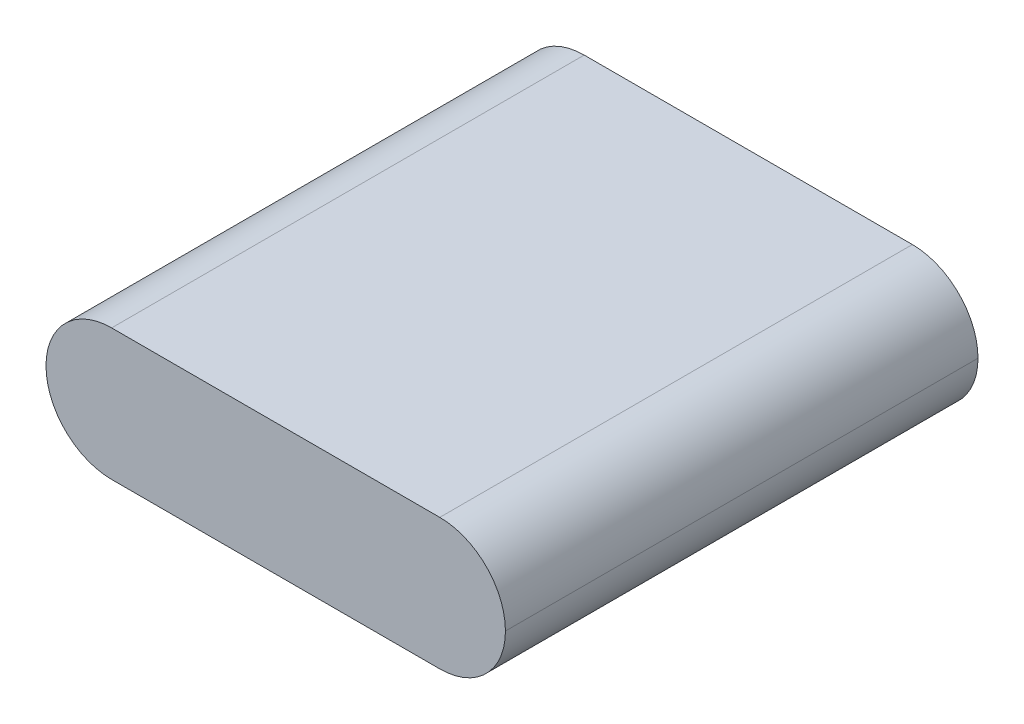
ISO-10303-21;
HEADER;
FILE_DESCRIPTION(('STEP AP214'),'2;1');
FILE_NAME('part.step','',(''),(''),'','','');
FILE_SCHEMA(('AUTOMOTIVE_DESIGN { 1 0 10303 214 1 1 1 1 }'));
ENDSEC;
DATA;
#1=APPLICATION_CONTEXT('core data for automotive mechanical design processes');
#2=APPLICATION_PROTOCOL_DEFINITION('international standard','automotive_design',2000,#1);
#3=PRODUCT_CONTEXT('',#1,'mechanical');
#4=PRODUCT('Part','Part','',(#3));
#5=PRODUCT_RELATED_PRODUCT_CATEGORY('part','',(#4));
#6=PRODUCT_DEFINITION_FORMATION('','',#4);
#7=PRODUCT_DEFINITION_CONTEXT('part definition',#1,'design');
#8=PRODUCT_DEFINITION('design','',#6,#7);
#9=PRODUCT_DEFINITION_SHAPE('','',#8);
#10=(LENGTH_UNIT() NAMED_UNIT(*) SI_UNIT(.MILLI.,.METRE.));
#11=(NAMED_UNIT(*) PLANE_ANGLE_UNIT() SI_UNIT($,.RADIAN.));
#12=(NAMED_UNIT(*) SI_UNIT($,.STERADIAN.) SOLID_ANGLE_UNIT());
#13=UNCERTAINTY_MEASURE_WITH_UNIT(LENGTH_MEASURE(1.E-05),#10,'distance_accuracy_value','');
#14=(GEOMETRIC_REPRESENTATION_CONTEXT(3) GLOBAL_UNCERTAINTY_ASSIGNED_CONTEXT((#13)) GLOBAL_UNIT_ASSIGNED_CONTEXT((#10,
#11,#12)) REPRESENTATION_CONTEXT('',''));
#15=CARTESIAN_POINT('',(0.,0.,0.));
#16=DIRECTION('',(0.,0.,1.));
#17=DIRECTION('',(1.,0.,0.));
#18=AXIS2_PLACEMENT_3D('',#15,#16,#17);
#19=CARTESIAN_POINT('',(0.,20.,0.));
#20=DIRECTION('',(0.,0.,-1.));
#21=DIRECTION('',(-1.,0.,0.));
#22=AXIS2_PLACEMENT_3D('',#19,#20,#21);
#23=PLANE('',#22);
#24=DIRECTION('',(1.,0.,0.));
#25=VECTOR('',#24,1.);
#26=CARTESIAN_POINT('',(0.,0.,0.));
#27=LINE('',#26,#25);
#28=CARTESIAN_POINT('',(10.,0.,0.));
#29=VERTEX_POINT('',#28);
#30=CARTESIAN_POINT('',(60.,0.,0.));
#31=VERTEX_POINT('',#30);
#32=EDGE_CURVE('E88',#29,#31,#27,.T.);
#33=ORIENTED_EDGE('',*,*,#32,.T.);
#34=CARTESIAN_POINT('',(60.,10.,0.));
#35=DIRECTION('',(0.,0.,-1.));
#36=DIRECTION('',(-1.,0.,0.));
#37=AXIS2_PLACEMENT_3D('',#34,#35,#36);
#38=CIRCLE('',#37,10.);
#39=CARTESIAN_POINT('',(70.,10.,0.));
#40=VERTEX_POINT('',#39);
#41=EDGE_CURVE('E114',#31,#40,#38,.F.);
#42=ORIENTED_EDGE('',*,*,#41,.T.);
#43=CARTESIAN_POINT('',(60.,10.,0.));
#44=DIRECTION('',(0.,0.,-1.));
#45=DIRECTION('',(-1.,0.,0.));
#46=AXIS2_PLACEMENT_3D('',#43,#44,#45);
#47=CIRCLE('',#46,10.);
#48=CARTESIAN_POINT('',(60.,20.,0.));
#49=VERTEX_POINT('',#48);
#50=EDGE_CURVE('E96',#40,#49,#47,.F.);
#51=ORIENTED_EDGE('',*,*,#50,.T.);
#52=DIRECTION('',(1.,0.,0.));
#53=VECTOR('',#52,1.);
#54=CARTESIAN_POINT('',(0.,20.,0.));
#55=LINE('',#54,#53);
#56=CARTESIAN_POINT('',(10.,20.,0.));
#57=VERTEX_POINT('',#56);
#58=EDGE_CURVE('E134',#57,#49,#55,.T.);
#59=ORIENTED_EDGE('',*,*,#58,.F.);
#60=CARTESIAN_POINT('',(10.,10.,0.));
#61=DIRECTION('',(0.,0.,-1.));
#62=DIRECTION('',(-1.,0.,0.));
#63=AXIS2_PLACEMENT_3D('',#60,#61,#62);
#64=CIRCLE('',#63,10.);
#65=CARTESIAN_POINT('',(0.,10.,0.));
#66=VERTEX_POINT('',#65);
#67=EDGE_CURVE('E91',#57,#66,#64,.F.);
#68=ORIENTED_EDGE('',*,*,#67,.T.);
#69=CARTESIAN_POINT('',(10.,10.,0.));
#70=DIRECTION('',(0.,0.,-1.));
#71=DIRECTION('',(-1.,0.,0.));
#72=AXIS2_PLACEMENT_3D('',#69,#70,#71);
#73=CIRCLE('',#72,10.);
#74=EDGE_CURVE('E86',#66,#29,#73,.F.);
#75=ORIENTED_EDGE('',*,*,#74,.T.);
#76=EDGE_LOOP('',(#33,#42,#51,#59,#68,#75));
#77=FACE_BOUND('',#76,.T.);
#78=ADVANCED_FACE('F32',(#77),#23,.F.);
#79=CARTESIAN_POINT('',(0.,20.,-72.));
#80=DIRECTION('',(0.,0.,1.));
#81=DIRECTION('',(1.,0.,0.));
#82=AXIS2_PLACEMENT_3D('',#79,#80,#81);
#83=PLANE('',#82);
#84=CARTESIAN_POINT('',(60.,10.,-72.));
#85=DIRECTION('',(0.,0.,1.));
#86=DIRECTION('',(1.,0.,0.));
#87=AXIS2_PLACEMENT_3D('',#84,#85,#86);
#88=CIRCLE('',#87,10.);
#89=CARTESIAN_POINT('',(60.,20.,-72.));
#90=VERTEX_POINT('',#89);
#91=CARTESIAN_POINT('',(70.,10.,-72.));
#92=VERTEX_POINT('',#91);
#93=EDGE_CURVE('E49',#90,#92,#88,.F.);
#94=ORIENTED_EDGE('',*,*,#93,.T.);
#95=CARTESIAN_POINT('',(60.,10.,-72.));
#96=DIRECTION('',(0.,0.,1.));
#97=DIRECTION('',(1.,0.,0.));
#98=AXIS2_PLACEMENT_3D('',#95,#96,#97);
#99=CIRCLE('',#98,10.);
#100=CARTESIAN_POINT('',(60.,0.,-72.));
#101=VERTEX_POINT('',#100);
#102=EDGE_CURVE('E120',#92,#101,#99,.F.);
#103=ORIENTED_EDGE('',*,*,#102,.T.);
#104=DIRECTION('',(-1.,0.,0.));
#105=VECTOR('',#104,1.);
#106=CARTESIAN_POINT('',(0.,0.,-72.));
#107=LINE('',#106,#105);
#108=CARTESIAN_POINT('',(10.,0.,-72.));
#109=VERTEX_POINT('',#108);
#110=EDGE_CURVE('E107',#101,#109,#107,.T.);
#111=ORIENTED_EDGE('',*,*,#110,.T.);
#112=CARTESIAN_POINT('',(10.,10.,-72.));
#113=DIRECTION('',(0.,0.,1.));
#114=DIRECTION('',(1.,0.,0.));
#115=AXIS2_PLACEMENT_3D('',#112,#113,#114);
#116=CIRCLE('',#115,10.);
#117=CARTESIAN_POINT('',(0.,10.,-72.));
#118=VERTEX_POINT('',#117);
#119=EDGE_CURVE('E111',#109,#118,#116,.F.);
#120=ORIENTED_EDGE('',*,*,#119,.T.);
#121=CARTESIAN_POINT('',(10.,10.,-72.));
#122=DIRECTION('',(0.,0.,1.));
#123=DIRECTION('',(1.,0.,0.));
#124=AXIS2_PLACEMENT_3D('',#121,#122,#123);
#125=CIRCLE('',#124,10.);
#126=CARTESIAN_POINT('',(10.,20.,-72.));
#127=VERTEX_POINT('',#126);
#128=EDGE_CURVE('E55',#118,#127,#125,.F.);
#129=ORIENTED_EDGE('',*,*,#128,.T.);
#130=DIRECTION('',(-1.,0.,0.));
#131=VECTOR('',#130,1.);
#132=CARTESIAN_POINT('',(0.,20.,-72.));
#133=LINE('',#132,#131);
#134=EDGE_CURVE('E133',#90,#127,#133,.T.);
#135=ORIENTED_EDGE('',*,*,#134,.F.);
#136=EDGE_LOOP('',(#94,#103,#111,#120,#129,#135));
#137=FACE_BOUND('',#136,.T.);
#138=ADVANCED_FACE('F151',(#137),#83,.F.);
#139=CARTESIAN_POINT('',(0.,20.,0.));
#140=DIRECTION('',(0.,-1.,0.));
#141=DIRECTION('',(0.,0.,-1.));
#142=AXIS2_PLACEMENT_3D('',#139,#140,#141);
#143=PLANE('',#142);
#144=ORIENTED_EDGE('',*,*,#58,.T.);
#145=DIRECTION('',(0.,0.,-1.));
#146=VECTOR('',#145,1.);
#147=CARTESIAN_POINT('',(60.,20.,0.));
#148=LINE('',#147,#146);
#149=EDGE_CURVE('E11',#49,#90,#148,.T.);
#150=ORIENTED_EDGE('',*,*,#149,.T.);
#151=ORIENTED_EDGE('',*,*,#134,.T.);
#152=DIRECTION('',(0.,0.,1.));
#153=VECTOR('',#152,1.);
#154=CARTESIAN_POINT('',(10.,20.,0.));
#155=LINE('',#154,#153);
#156=EDGE_CURVE('E41',#127,#57,#155,.T.);
#157=ORIENTED_EDGE('',*,*,#156,.T.);
#158=EDGE_LOOP('',(#144,#150,#151,#157));
#159=FACE_BOUND('',#158,.T.);
#160=ADVANCED_FACE('F138',(#159),#143,.F.);
#161=CARTESIAN_POINT('',(0.,0.,0.));
#162=DIRECTION('',(0.,-1.,0.));
#163=DIRECTION('',(0.,0.,-1.));
#164=AXIS2_PLACEMENT_3D('',#161,#162,#163);
#165=PLANE('',#164);
#166=ORIENTED_EDGE('',*,*,#32,.F.);
#167=DIRECTION('',(0.,0.,1.));
#168=VECTOR('',#167,1.);
#169=CARTESIAN_POINT('',(10.,0.,-72.));
#170=LINE('',#169,#168);
#171=EDGE_CURVE('E103',#29,#109,#170,.F.);
#172=ORIENTED_EDGE('',*,*,#171,.T.);
#173=ORIENTED_EDGE('',*,*,#110,.F.);
#174=DIRECTION('',(0.,0.,-1.));
#175=VECTOR('',#174,1.);
#176=CARTESIAN_POINT('',(60.,0.,0.));
#177=LINE('',#176,#175);
#178=EDGE_CURVE('E106',#101,#31,#177,.F.);
#179=ORIENTED_EDGE('',*,*,#178,.T.);
#180=EDGE_LOOP('',(#166,#172,#173,#179));
#181=FACE_BOUND('',#180,.T.);
#182=ADVANCED_FACE('F101',(#181),#165,.T.);
#183=CARTESIAN_POINT('',(10.,10.,0.));
#184=DIRECTION('',(0.,0.,1.));
#185=DIRECTION('',(1.,0.,0.));
#186=AXIS2_PLACEMENT_3D('',#183,#184,#185);
#187=CYLINDRICAL_SURFACE('',#186,10.);
#188=ORIENTED_EDGE('',*,*,#156,.F.);
#189=ORIENTED_EDGE('',*,*,#128,.F.);
#190=DIRECTION('',(0.,0.,1.));
#191=VECTOR('',#190,1.);
#192=CARTESIAN_POINT('',(0.,10.,0.));
#193=LINE('',#192,#191);
#194=EDGE_CURVE('E108',#66,#118,#193,.F.);
#195=ORIENTED_EDGE('',*,*,#194,.F.);
#196=ORIENTED_EDGE('',*,*,#67,.F.);
#197=EDGE_LOOP('',(#188,#189,#195,#196));
#198=FACE_BOUND('',#197,.T.);
#199=ADVANCED_FACE('F141',(#198),#187,.T.);
#200=CARTESIAN_POINT('',(10.,10.,0.));
#201=DIRECTION('',(0.,0.,-1.));
#202=DIRECTION('',(-1.,0.,0.));
#203=AXIS2_PLACEMENT_3D('',#200,#201,#202);
#204=CYLINDRICAL_SURFACE('',#203,10.);
#205=ORIENTED_EDGE('',*,*,#119,.F.);
#206=ORIENTED_EDGE('',*,*,#171,.F.);
#207=ORIENTED_EDGE('',*,*,#74,.F.);
#208=ORIENTED_EDGE('',*,*,#194,.T.);
#209=EDGE_LOOP('',(#205,#206,#207,#208));
#210=FACE_BOUND('',#209,.T.);
#211=ADVANCED_FACE('F110',(#210),#204,.T.);
#212=CARTESIAN_POINT('',(60.,10.,0.));
#213=DIRECTION('',(0.,0.,-1.));
#214=DIRECTION('',(-1.,0.,0.));
#215=AXIS2_PLACEMENT_3D('',#212,#213,#214);
#216=CYLINDRICAL_SURFACE('',#215,10.);
#217=ORIENTED_EDGE('',*,*,#149,.F.);
#218=ORIENTED_EDGE('',*,*,#50,.F.);
#219=DIRECTION('',(0.,0.,-1.));
#220=VECTOR('',#219,1.);
#221=CARTESIAN_POINT('',(70.,10.,0.));
#222=LINE('',#221,#220);
#223=EDGE_CURVE('E36',#92,#40,#222,.F.);
#224=ORIENTED_EDGE('',*,*,#223,.F.);
#225=ORIENTED_EDGE('',*,*,#93,.F.);
#226=EDGE_LOOP('',(#217,#218,#224,#225));
#227=FACE_BOUND('',#226,.T.);
#228=ADVANCED_FACE('F34',(#227),#216,.T.);
#229=CARTESIAN_POINT('',(60.,10.,0.));
#230=DIRECTION('',(0.,0.,1.));
#231=DIRECTION('',(1.,0.,0.));
#232=AXIS2_PLACEMENT_3D('',#229,#230,#231);
#233=CYLINDRICAL_SURFACE('',#232,10.);
#234=ORIENTED_EDGE('',*,*,#41,.F.);
#235=ORIENTED_EDGE('',*,*,#178,.F.);
#236=ORIENTED_EDGE('',*,*,#102,.F.);
#237=ORIENTED_EDGE('',*,*,#223,.T.);
#238=EDGE_LOOP('',(#234,#235,#236,#237));
#239=FACE_BOUND('',#238,.T.);
#240=ADVANCED_FACE('F125',(#239),#233,.T.);
#241=CLOSED_SHELL('',(#78,#138,#160,#182,#199,#211,#228,#240));
#242=MANIFOLD_SOLID_BREP('B2',#241);
#243=ADVANCED_BREP_SHAPE_REPRESENTATION('',(#18,#242),#14);
#244=SHAPE_DEFINITION_REPRESENTATION(#9,#243);
ENDSEC;
END-ISO-10303-21;
